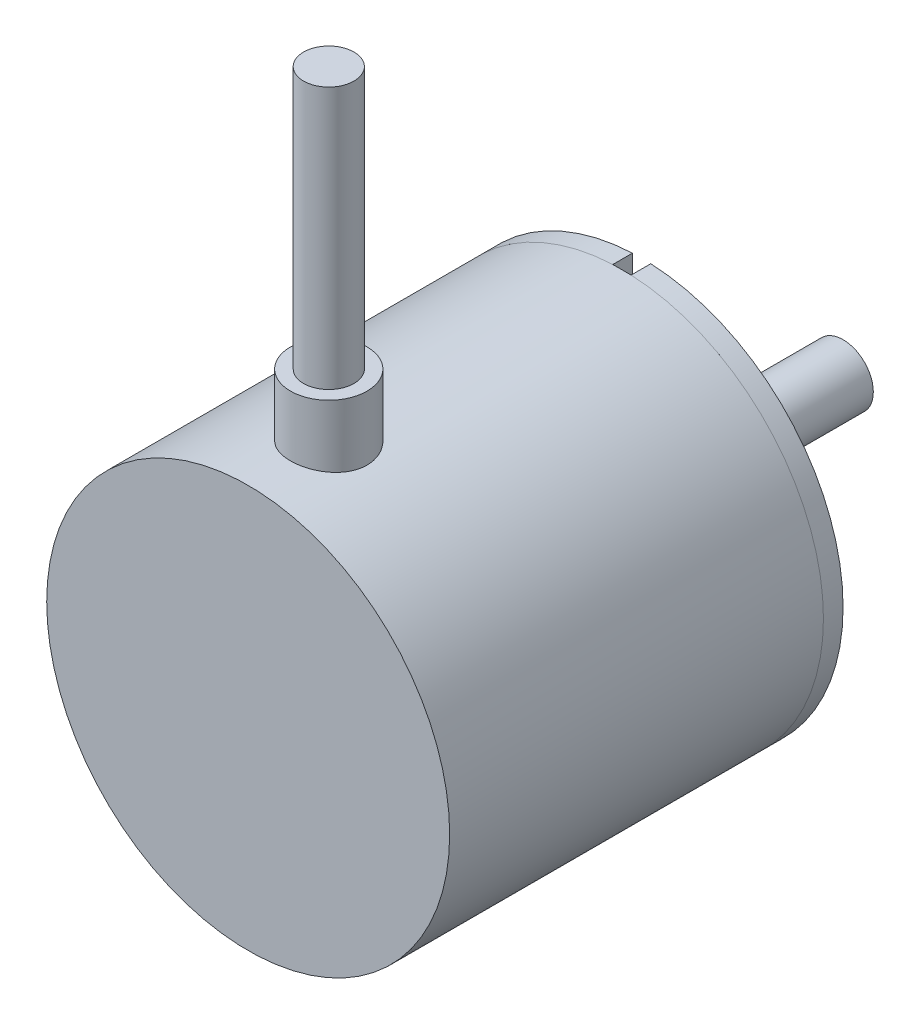
ISO-10303-21;
HEADER;
FILE_DESCRIPTION(('STEP AP214'),'2;1');
FILE_NAME('part.step','',(''),(''),'','','');
FILE_SCHEMA(('AUTOMOTIVE_DESIGN { 1 0 10303 214 1 1 1 1 }'));
ENDSEC;
DATA;
#1=APPLICATION_CONTEXT('core data for automotive mechanical design processes');
#2=APPLICATION_PROTOCOL_DEFINITION('international standard','automotive_design',2000,#1);
#3=PRODUCT_CONTEXT('',#1,'mechanical');
#4=PRODUCT('Part','Part','',(#3));
#5=PRODUCT_RELATED_PRODUCT_CATEGORY('part','',(#4));
#6=PRODUCT_DEFINITION_FORMATION('','',#4);
#7=PRODUCT_DEFINITION_CONTEXT('part definition',#1,'design');
#8=PRODUCT_DEFINITION('design','',#6,#7);
#9=PRODUCT_DEFINITION_SHAPE('','',#8);
#10=(LENGTH_UNIT() NAMED_UNIT(*) SI_UNIT(.MILLI.,.METRE.));
#11=(NAMED_UNIT(*) PLANE_ANGLE_UNIT() SI_UNIT($,.RADIAN.));
#12=(NAMED_UNIT(*) SI_UNIT($,.STERADIAN.) SOLID_ANGLE_UNIT());
#13=UNCERTAINTY_MEASURE_WITH_UNIT(LENGTH_MEASURE(1.E-05),#10,'distance_accuracy_value','');
#14=(GEOMETRIC_REPRESENTATION_CONTEXT(3) GLOBAL_UNCERTAINTY_ASSIGNED_CONTEXT((#13)) GLOBAL_UNIT_ASSIGNED_CONTEXT((#10,
#11,#12)) REPRESENTATION_CONTEXT('',''));
#15=CARTESIAN_POINT('',(0.,0.,0.));
#16=DIRECTION('',(0.,0.,1.));
#17=DIRECTION('',(1.,0.,0.));
#18=AXIS2_PLACEMENT_3D('',#15,#16,#17);
#19=CARTESIAN_POINT('',(0.,0.,0.));
#20=DIRECTION('',(0.,0.,1.));
#21=DIRECTION('',(1.,0.,0.));
#22=AXIS2_PLACEMENT_3D('',#19,#20,#21);
#23=PLANE('',#22);
#24=CARTESIAN_POINT('',(0.,0.,0.));
#25=DIRECTION('',(0.,0.,1.));
#26=DIRECTION('',(1.,0.,0.));
#27=AXIS2_PLACEMENT_3D('',#24,#25,#26);
#28=CIRCLE('',#27,10.);
#29=CARTESIAN_POINT('',(10.,0.,0.));
#30=VERTEX_POINT('',#29);
#31=EDGE_CURVE('E135',#30,#30,#28,.F.);
#32=ORIENTED_EDGE('',*,*,#31,.F.);
#33=EDGE_LOOP('',(#32));
#34=FACE_BOUND('',#33,.T.);
#35=CARTESIAN_POINT('',(0.,15.,0.));
#36=DIRECTION('',(0.,0.,-1.));
#37=DIRECTION('',(-1.,0.,0.));
#38=AXIS2_PLACEMENT_3D('',#35,#36,#37);
#39=CIRCLE('',#38,1.00000000000079);
#40=CARTESIAN_POINT('',(-1.00000000000079,15.,0.));
#41=VERTEX_POINT('',#40);
#42=EDGE_CURVE('E149',#41,#41,#39,.T.);
#43=ORIENTED_EDGE('',*,*,#42,.F.);
#44=EDGE_LOOP('',(#43));
#45=FACE_BOUND('',#44,.T.);
#46=CARTESIAN_POINT('',(-12.9903810567675,-7.49999999999947,0.));
#47=DIRECTION('',(0.,0.,-1.));
#48=DIRECTION('',(-1.,0.,0.));
#49=AXIS2_PLACEMENT_3D('',#46,#47,#48);
#50=CIRCLE('',#49,1.00000000000079);
#51=CARTESIAN_POINT('',(-13.9903810567683,-7.49999999999947,0.));
#52=VERTEX_POINT('',#51);
#53=EDGE_CURVE('E154',#52,#52,#50,.T.);
#54=ORIENTED_EDGE('',*,*,#53,.F.);
#55=EDGE_LOOP('',(#54));
#56=FACE_BOUND('',#55,.T.);
#57=CARTESIAN_POINT('',(12.9903810567657,-7.50000000000052,0.));
#58=DIRECTION('',(0.,0.,-1.));
#59=DIRECTION('',(-1.,0.,0.));
#60=AXIS2_PLACEMENT_3D('',#57,#58,#59);
#61=CIRCLE('',#60,1.00000000000079);
#62=CARTESIAN_POINT('',(11.9903810567649,-7.50000000000052,0.));
#63=VERTEX_POINT('',#62);
#64=EDGE_CURVE('E158',#63,#63,#61,.T.);
#65=ORIENTED_EDGE('',*,*,#64,.F.);
#66=EDGE_LOOP('',(#65));
#67=FACE_BOUND('',#66,.T.);
#68=DIRECTION('',(0.,-1.,0.));
#69=VECTOR('',#68,1.);
#70=CARTESIAN_POINT('',(-0.91,0.,0.));
#71=LINE('',#70,#69);
#72=CARTESIAN_POINT('',(-0.91,19.9792867740568,0.));
#73=VERTEX_POINT('',#72);
#74=CARTESIAN_POINT('',(-0.91,18.0794623505173,0.));
#75=VERTEX_POINT('',#74);
#76=EDGE_CURVE('E104',#73,#75,#71,.T.);
#77=ORIENTED_EDGE('',*,*,#76,.T.);
#78=DIRECTION('',(-1.,0.,0.));
#79=VECTOR('',#78,1.);
#80=CARTESIAN_POINT('',(0.,18.0794623505173,0.));
#81=LINE('',#80,#79);
#82=CARTESIAN_POINT('',(0.91,18.0794623505173,0.));
#83=VERTEX_POINT('',#82);
#84=EDGE_CURVE('E86',#83,#75,#81,.T.);
#85=ORIENTED_EDGE('',*,*,#84,.F.);
#86=DIRECTION('',(0.,-1.,0.));
#87=VECTOR('',#86,1.);
#88=CARTESIAN_POINT('',(0.91,0.,0.));
#89=LINE('',#88,#87);
#90=CARTESIAN_POINT('',(0.91,19.9792867740568,0.));
#91=VERTEX_POINT('',#90);
#92=EDGE_CURVE('E94',#91,#83,#89,.T.);
#93=ORIENTED_EDGE('',*,*,#92,.F.);
#94=CARTESIAN_POINT('',(0.,0.,0.));
#95=DIRECTION('',(0.,0.,1.));
#96=DIRECTION('',(1.,0.,0.));
#97=AXIS2_PLACEMENT_3D('',#94,#95,#96);
#98=CIRCLE('',#97,20.);
#99=EDGE_CURVE('E165',#73,#91,#98,.T.);
#100=ORIENTED_EDGE('',*,*,#99,.F.);
#101=EDGE_LOOP('',(#77,#85,#93,#100));
#102=FACE_BOUND('',#101,.T.);
#103=ADVANCED_FACE('F47',(#34,#45,#56,#67,#102),#23,.F.);
#104=CARTESIAN_POINT('',(0.,0.,1.95));
#105=DIRECTION('',(0.,0.,-1.));
#106=DIRECTION('',(-1.,0.,0.));
#107=AXIS2_PLACEMENT_3D('',#104,#105,#106);
#108=CYLINDRICAL_SURFACE('',#107,20.);
#109=DIRECTION('',(0.,0.,-1.));
#110=VECTOR('',#109,1.);
#111=CARTESIAN_POINT('',(-0.91,19.9792867740568,2.3));
#112=LINE('',#111,#110);
#113=CARTESIAN_POINT('',(-0.91,19.9792867740568,1.95));
#114=VERTEX_POINT('',#113);
#115=EDGE_CURVE('E116',#114,#73,#112,.T.);
#116=ORIENTED_EDGE('',*,*,#115,.T.);
#117=ORIENTED_EDGE('',*,*,#99,.T.);
#118=DIRECTION('',(0.,0.,-1.));
#119=VECTOR('',#118,1.);
#120=CARTESIAN_POINT('',(0.91,19.9792867740568,2.3));
#121=LINE('',#120,#119);
#122=CARTESIAN_POINT('',(0.91,19.9792867740568,1.95));
#123=VERTEX_POINT('',#122);
#124=EDGE_CURVE('E97',#123,#91,#121,.T.);
#125=ORIENTED_EDGE('',*,*,#124,.F.);
#126=CARTESIAN_POINT('',(0.,0.,1.95));
#127=DIRECTION('',(0.,0.,1.));
#128=DIRECTION('',(1.,0.,0.));
#129=AXIS2_PLACEMENT_3D('',#126,#127,#128);
#130=CIRCLE('',#129,20.);
#131=EDGE_CURVE('E136',#114,#123,#130,.T.);
#132=ORIENTED_EDGE('',*,*,#131,.F.);
#133=EDGE_LOOP('',(#116,#117,#125,#132));
#134=FACE_BOUND('',#133,.T.);
#135=ADVANCED_FACE('F187',(#134),#108,.T.);
#136=CARTESIAN_POINT('',(0.,0.,1.95));
#137=DIRECTION('',(0.,0.,1.));
#138=DIRECTION('',(1.,0.,0.));
#139=AXIS2_PLACEMENT_3D('',#136,#137,#138);
#140=PLANE('',#139);
#141=CARTESIAN_POINT('',(0.,15.,1.95));
#142=DIRECTION('',(0.,0.,1.));
#143=DIRECTION('',(1.,0.,0.));
#144=AXIS2_PLACEMENT_3D('',#141,#142,#143);
#145=CIRCLE('',#144,1.00000000000079);
#146=CARTESIAN_POINT('',(1.00000000000079,15.,1.95));
#147=VERTEX_POINT('',#146);
#148=EDGE_CURVE('E141',#147,#147,#145,.T.);
#149=ORIENTED_EDGE('',*,*,#148,.F.);
#150=EDGE_LOOP('',(#149));
#151=FACE_BOUND('',#150,.T.);
#152=CARTESIAN_POINT('',(-12.9903810567675,-7.49999999999947,1.95));
#153=DIRECTION('',(0.,0.,1.));
#154=DIRECTION('',(1.,0.,0.));
#155=AXIS2_PLACEMENT_3D('',#152,#153,#154);
#156=CIRCLE('',#155,1.00000000000079);
#157=CARTESIAN_POINT('',(-11.9903810567667,-7.49999999999947,1.95));
#158=VERTEX_POINT('',#157);
#159=EDGE_CURVE('E153',#158,#158,#156,.T.);
#160=ORIENTED_EDGE('',*,*,#159,.F.);
#161=EDGE_LOOP('',(#160));
#162=FACE_BOUND('',#161,.T.);
#163=CARTESIAN_POINT('',(12.9903810567657,-7.50000000000052,1.95));
#164=DIRECTION('',(0.,0.,1.));
#165=DIRECTION('',(1.,0.,0.));
#166=AXIS2_PLACEMENT_3D('',#163,#164,#165);
#167=CIRCLE('',#166,1.00000000000079);
#168=CARTESIAN_POINT('',(13.9903810567665,-7.50000000000052,1.95));
#169=VERTEX_POINT('',#168);
#170=EDGE_CURVE('E157',#169,#169,#167,.T.);
#171=ORIENTED_EDGE('',*,*,#170,.F.);
#172=EDGE_LOOP('',(#171));
#173=FACE_BOUND('',#172,.T.);
#174=DIRECTION('',(1.,0.,0.));
#175=VECTOR('',#174,1.);
#176=CARTESIAN_POINT('',(0.,18.0794623505173,1.95));
#177=LINE('',#176,#175);
#178=CARTESIAN_POINT('',(-0.91,18.0794623505173,1.95));
#179=VERTEX_POINT('',#178);
#180=CARTESIAN_POINT('',(0.91,18.0794623505173,1.95));
#181=VERTEX_POINT('',#180);
#182=EDGE_CURVE('E89',#179,#181,#177,.T.);
#183=ORIENTED_EDGE('',*,*,#182,.F.);
#184=DIRECTION('',(0.,1.,0.));
#185=VECTOR('',#184,1.);
#186=CARTESIAN_POINT('',(-0.91,0.,1.95));
#187=LINE('',#186,#185);
#188=EDGE_CURVE('E145',#179,#114,#187,.T.);
#189=ORIENTED_EDGE('',*,*,#188,.T.);
#190=ORIENTED_EDGE('',*,*,#131,.T.);
#191=DIRECTION('',(0.,1.,0.));
#192=VECTOR('',#191,1.);
#193=CARTESIAN_POINT('',(0.91,0.,1.95));
#194=LINE('',#193,#192);
#195=EDGE_CURVE('E106',#181,#123,#194,.T.);
#196=ORIENTED_EDGE('',*,*,#195,.F.);
#197=EDGE_LOOP('',(#183,#189,#190,#196));
#198=FACE_BOUND('',#197,.T.);
#199=ADVANCED_FACE('F128',(#151,#162,#173,#198),#140,.T.);
#200=CARTESIAN_POINT('',(0.,0.,-5.));
#201=DIRECTION('',(0.,0.,-1.));
#202=DIRECTION('',(-1.,0.,0.));
#203=AXIS2_PLACEMENT_3D('',#200,#201,#202);
#204=PLANE('',#203);
#205=CARTESIAN_POINT('',(0.,0.,-5.));
#206=DIRECTION('',(0.,0.,-1.));
#207=DIRECTION('',(-1.,0.,0.));
#208=AXIS2_PLACEMENT_3D('',#205,#206,#207);
#209=CIRCLE('',#208,7.5);
#210=CARTESIAN_POINT('',(-7.5,0.,-5.));
#211=VERTEX_POINT('',#210);
#212=EDGE_CURVE('E57',#211,#211,#209,.T.);
#213=ORIENTED_EDGE('',*,*,#212,.F.);
#214=EDGE_LOOP('',(#213));
#215=FACE_BOUND('',#214,.T.);
#216=CARTESIAN_POINT('',(0.,0.,-5.));
#217=DIRECTION('',(0.,0.,-1.));
#218=DIRECTION('',(-1.,0.,0.));
#219=AXIS2_PLACEMENT_3D('',#216,#217,#218);
#220=CIRCLE('',#219,10.);
#221=CARTESIAN_POINT('',(-10.,0.,-5.));
#222=VERTEX_POINT('',#221);
#223=EDGE_CURVE('E132',#222,#222,#220,.T.);
#224=ORIENTED_EDGE('',*,*,#223,.T.);
#225=EDGE_LOOP('',(#224));
#226=FACE_BOUND('',#225,.T.);
#227=ADVANCED_FACE('F124',(#215,#226),#204,.T.);
#228=CARTESIAN_POINT('',(0.,0.,-5.));
#229=DIRECTION('',(0.,0.,1.));
#230=DIRECTION('',(1.,0.,0.));
#231=AXIS2_PLACEMENT_3D('',#228,#229,#230);
#232=CYLINDRICAL_SURFACE('',#231,10.);
#233=ORIENTED_EDGE('',*,*,#223,.F.);
#234=EDGE_LOOP('',(#233));
#235=FACE_BOUND('',#234,.T.);
#236=ORIENTED_EDGE('',*,*,#31,.T.);
#237=EDGE_LOOP('',(#236));
#238=FACE_BOUND('',#237,.T.);
#239=ADVANCED_FACE('F127',(#235,#238),#232,.T.);
#240=CARTESIAN_POINT('',(0.,15.,10.));
#241=DIRECTION('',(0.,0.,-1.));
#242=DIRECTION('',(-1.,0.,0.));
#243=AXIS2_PLACEMENT_3D('',#240,#241,#242);
#244=CYLINDRICAL_SURFACE('',#243,1.00000000000079);
#245=ORIENTED_EDGE('',*,*,#148,.T.);
#246=EDGE_LOOP('',(#245));
#247=FACE_BOUND('',#246,.T.);
#248=ORIENTED_EDGE('',*,*,#42,.T.);
#249=EDGE_LOOP('',(#248));
#250=FACE_BOUND('',#249,.T.);
#251=ADVANCED_FACE('F200',(#247,#250),#244,.F.);
#252=CARTESIAN_POINT('',(-12.9903810567675,-7.49999999999947,10.));
#253=DIRECTION('',(0.,0.,-1.));
#254=DIRECTION('',(-1.,0.,0.));
#255=AXIS2_PLACEMENT_3D('',#252,#253,#254);
#256=CYLINDRICAL_SURFACE('',#255,1.00000000000079);
#257=ORIENTED_EDGE('',*,*,#159,.T.);
#258=EDGE_LOOP('',(#257));
#259=FACE_BOUND('',#258,.T.);
#260=ORIENTED_EDGE('',*,*,#53,.T.);
#261=EDGE_LOOP('',(#260));
#262=FACE_BOUND('',#261,.T.);
#263=ADVANCED_FACE('F204',(#259,#262),#256,.F.);
#264=CARTESIAN_POINT('',(12.9903810567657,-7.50000000000052,10.));
#265=DIRECTION('',(0.,0.,-1.));
#266=DIRECTION('',(-1.,0.,0.));
#267=AXIS2_PLACEMENT_3D('',#264,#265,#266);
#268=CYLINDRICAL_SURFACE('',#267,1.00000000000079);
#269=ORIENTED_EDGE('',*,*,#170,.T.);
#270=EDGE_LOOP('',(#269));
#271=FACE_BOUND('',#270,.T.);
#272=ORIENTED_EDGE('',*,*,#64,.T.);
#273=EDGE_LOOP('',(#272));
#274=FACE_BOUND('',#273,.T.);
#275=ADVANCED_FACE('F208',(#271,#274),#268,.F.);
#276=CARTESIAN_POINT('',(-0.91,0.,2.3));
#277=DIRECTION('',(1.,0.,0.));
#278=DIRECTION('',(0.,0.,-1.));
#279=AXIS2_PLACEMENT_3D('',#276,#277,#278);
#280=PLANE('',#279);
#281=DIRECTION('',(0.,0.,-1.));
#282=VECTOR('',#281,1.);
#283=CARTESIAN_POINT('',(-0.91,18.0794623505173,2.3));
#284=LINE('',#283,#282);
#285=EDGE_CURVE('E113',#179,#75,#284,.T.);
#286=ORIENTED_EDGE('',*,*,#285,.T.);
#287=ORIENTED_EDGE('',*,*,#76,.F.);
#288=ORIENTED_EDGE('',*,*,#115,.F.);
#289=ORIENTED_EDGE('',*,*,#188,.F.);
#290=EDGE_LOOP('',(#286,#287,#288,#289));
#291=FACE_BOUND('',#290,.T.);
#292=ADVANCED_FACE('F186',(#291),#280,.T.);
#293=CARTESIAN_POINT('',(0.,18.0794623505173,2.3));
#294=DIRECTION('',(0.,-1.,0.));
#295=DIRECTION('',(0.,0.,-1.));
#296=AXIS2_PLACEMENT_3D('',#293,#294,#295);
#297=PLANE('',#296);
#298=ORIENTED_EDGE('',*,*,#182,.T.);
#299=DIRECTION('',(0.,0.,-1.));
#300=VECTOR('',#299,1.);
#301=CARTESIAN_POINT('',(0.91,18.0794623505173,2.3));
#302=LINE('',#301,#300);
#303=EDGE_CURVE('E65',#181,#83,#302,.T.);
#304=ORIENTED_EDGE('',*,*,#303,.T.);
#305=ORIENTED_EDGE('',*,*,#84,.T.);
#306=ORIENTED_EDGE('',*,*,#285,.F.);
#307=EDGE_LOOP('',(#298,#304,#305,#306));
#308=FACE_BOUND('',#307,.T.);
#309=ADVANCED_FACE('F83',(#308),#297,.F.);
#310=CARTESIAN_POINT('',(0.91,0.,2.3));
#311=DIRECTION('',(1.,0.,0.));
#312=DIRECTION('',(0.,0.,-1.));
#313=AXIS2_PLACEMENT_3D('',#310,#311,#312);
#314=PLANE('',#313);
#315=ORIENTED_EDGE('',*,*,#195,.T.);
#316=ORIENTED_EDGE('',*,*,#124,.T.);
#317=ORIENTED_EDGE('',*,*,#92,.T.);
#318=ORIENTED_EDGE('',*,*,#303,.F.);
#319=EDGE_LOOP('',(#315,#316,#317,#318));
#320=FACE_BOUND('',#319,.T.);
#321=ADVANCED_FACE('F95',(#320),#314,.F.);
#322=CARTESIAN_POINT('',(0.,0.,-4.9));
#323=DIRECTION('',(0.,0.,-1.));
#324=DIRECTION('',(-1.,0.,0.));
#325=AXIS2_PLACEMENT_3D('',#322,#323,#324);
#326=CYLINDRICAL_SURFACE('',#325,7.5);
#327=CARTESIAN_POINT('',(0.,0.,-4.9));
#328=DIRECTION('',(0.,0.,-1.));
#329=DIRECTION('',(-1.,0.,0.));
#330=AXIS2_PLACEMENT_3D('',#327,#328,#329);
#331=CIRCLE('',#330,7.5);
#332=CARTESIAN_POINT('',(-7.5,0.,-4.9));
#333=VERTEX_POINT('',#332);
#334=EDGE_CURVE('E12',#333,#333,#331,.T.);
#335=ORIENTED_EDGE('',*,*,#334,.F.);
#336=EDGE_LOOP('',(#335));
#337=FACE_BOUND('',#336,.T.);
#338=ORIENTED_EDGE('',*,*,#212,.T.);
#339=EDGE_LOOP('',(#338));
#340=FACE_BOUND('',#339,.T.);
#341=ADVANCED_FACE('F122',(#337,#340),#326,.F.);
#342=CARTESIAN_POINT('',(0.,0.,-4.9));
#343=DIRECTION('',(0.,0.,-1.));
#344=DIRECTION('',(-1.,0.,0.));
#345=AXIS2_PLACEMENT_3D('',#342,#343,#344);
#346=PLANE('',#345);
#347=ORIENTED_EDGE('',*,*,#334,.T.);
#348=EDGE_LOOP('',(#347));
#349=FACE_BOUND('',#348,.T.);
#350=ADVANCED_FACE('F49',(#349),#346,.T.);
#351=CLOSED_SHELL('',(#103,#135,#199,#227,#239,#251,#263,#275,#292,#309,#321,#341,#350));
#352=MANIFOLD_SOLID_BREP('B2',#351);
#353=CARTESIAN_POINT('',(0.,26.,31.05));
#354=DIRECTION('',(0.,1.,0.));
#355=DIRECTION('',(0.,0.,1.));
#356=AXIS2_PLACEMENT_3D('',#353,#354,#355);
#357=PLANE('',#356);
#358=CARTESIAN_POINT('',(0.,26.,31.05));
#359=DIRECTION('',(0.,1.,0.));
#360=DIRECTION('',(0.,0.,1.));
#361=AXIS2_PLACEMENT_3D('',#358,#359,#360);
#362=CIRCLE('',#361,3.8);
#363=CARTESIAN_POINT('',(0.,26.,34.85));
#364=VERTEX_POINT('',#363);
#365=EDGE_CURVE('E379',#364,#364,#362,.T.);
#366=ORIENTED_EDGE('',*,*,#365,.T.);
#367=EDGE_LOOP('',(#366));
#368=FACE_BOUND('',#367,.T.);
#369=CARTESIAN_POINT('',(0.,26.,31.05));
#370=DIRECTION('',(0.,1.,0.));
#371=DIRECTION('',(0.,0.,1.));
#372=AXIS2_PLACEMENT_3D('',#369,#370,#371);
#373=CIRCLE('',#372,2.5);
#374=CARTESIAN_POINT('',(0.,26.,28.55));
#375=VERTEX_POINT('',#374);
#376=EDGE_CURVE('E385',#375,#375,#373,.T.);
#377=ORIENTED_EDGE('',*,*,#376,.F.);
#378=EDGE_LOOP('',(#377));
#379=FACE_BOUND('',#378,.T.);
#380=ADVANCED_FACE('F355',(#368,#379),#357,.T.);
#381=CARTESIAN_POINT('',(0.,0.,39.05));
#382=DIRECTION('',(0.,0.,-1.));
#383=DIRECTION('',(-1.,0.,0.));
#384=AXIS2_PLACEMENT_3D('',#381,#382,#383);
#385=CYLINDRICAL_SURFACE('',#384,20.);
#386=CARTESIAN_POINT('',(0.,0.,1.95));
#387=DIRECTION('',(0.,0.,1.));
#388=DIRECTION('',(1.,0.,0.));
#389=AXIS2_PLACEMENT_3D('',#386,#387,#388);
#390=CIRCLE('',#389,20.);
#391=CARTESIAN_POINT('',(20.,0.,1.95));
#392=VERTEX_POINT('',#391);
#393=EDGE_CURVE('E373',#392,#392,#390,.T.);
#394=ORIENTED_EDGE('',*,*,#393,.T.);
#395=EDGE_LOOP('',(#394));
#396=FACE_BOUND('',#395,.T.);
#397=CARTESIAN_POINT('',(0.,0.,39.05));
#398=DIRECTION('',(0.,0.,1.));
#399=DIRECTION('',(1.,0.,0.));
#400=AXIS2_PLACEMENT_3D('',#397,#398,#399);
#401=CIRCLE('',#400,20.);
#402=CARTESIAN_POINT('',(20.,0.,39.05));
#403=VERTEX_POINT('',#402);
#404=EDGE_CURVE('E367',#403,#403,#401,.T.);
#405=ORIENTED_EDGE('',*,*,#404,.F.);
#406=EDGE_LOOP('',(#405));
#407=FACE_BOUND('',#406,.T.);
#408=CARTESIAN_POINT('',(0.,20.,27.25));
#409=CARTESIAN_POINT('',(-0.211409170467327,19.9999961542323,27.2500080221101));
#410=CARTESIAN_POINT('',(-0.422922127898354,19.9966133928819,27.2677019195789));
#411=CARTESIAN_POINT('',(-0.839984159024682,19.9834449848688,27.3379623654532));
#412=CARTESIAN_POINT('',(-1.04552810753821,19.9736539963158,27.390558008419));
#413=CARTESIAN_POINT('',(-1.44456049920717,19.9487640007985,27.528950449601));
#414=CARTESIAN_POINT('',(-1.63805977200262,19.9336698456168,27.6147169075731));
#415=CARTESIAN_POINT('',(-2.00790510956374,19.8998203363427,27.8169294664745));
#416=CARTESIAN_POINT('',(-2.18425248934359,19.8810652632604,27.9333732128719));
#417=CARTESIAN_POINT('',(-2.51697105215255,19.8417053033425,28.195152721675));
#418=CARTESIAN_POINT('',(-2.67310113064527,19.8210823362121,28.3407922378417));
#419=CARTESIAN_POINT('',(-2.95886696734129,19.7804445961867,28.6561757865699));
#420=CARTESIAN_POINT('',(-3.08850079078569,19.7604298677961,28.8259215778409));
#421=CARTESIAN_POINT('',(-3.31860168020194,19.7230988451207,29.1864090605948));
#422=CARTESIAN_POINT('',(-3.41882262654874,19.705805853158,29.37731047713));
#423=CARTESIAN_POINT('',(-3.58567706988605,19.6761314285786,29.7736245855497));
#424=CARTESIAN_POINT('',(-3.6523135449711,19.6637495604899,29.9790359889224));
#425=CARTESIAN_POINT('',(-3.74933194374608,19.6454814650498,30.3959565887778));
#426=CARTESIAN_POINT('',(-3.78013484392349,19.6395198747464,30.607364455082));
#427=CARTESIAN_POINT('',(-3.80591857594181,19.634540186021,31.0324252533447));
#428=CARTESIAN_POINT('',(-3.80090270756635,19.6355214479927,31.2460779766861));
#429=CARTESIAN_POINT('',(-3.75553244831974,19.6442480072405,31.6665079036574));
#430=CARTESIAN_POINT('',(-3.71565751410713,19.6519015293418,31.8733390341715));
#431=CARTESIAN_POINT('',(-3.60245643623646,19.6729660265244,32.277321398546));
#432=CARTESIAN_POINT('',(-3.52912883658626,19.6863772522022,32.4744722106669));
#433=CARTESIAN_POINT('',(-3.35063720584687,19.7175415756265,32.8548962890743));
#434=CARTESIAN_POINT('',(-3.24528027247544,19.7353208526614,33.038076814078));
#435=CARTESIAN_POINT('',(-3.00585703473046,19.7732007899193,33.3843394509841));
#436=CARTESIAN_POINT('',(-2.87178774114429,19.7933016917437,33.5474194674571));
#437=CARTESIAN_POINT('',(-2.57616400040746,19.8339594539179,33.8516213185564));
#438=CARTESIAN_POINT('',(-2.41419962980204,19.8545184267878,33.9923448095286));
#439=CARTESIAN_POINT('',(-2.06875314340881,19.8934769245016,34.244684963348));
#440=CARTESIAN_POINT('',(-1.88527080077558,19.9118764265761,34.3563013193038));
#441=CARTESIAN_POINT('',(-1.50157598041669,19.9444815207307,34.5473204324655));
#442=CARTESIAN_POINT('',(-1.30134198123535,19.9586816081353,34.6266809586306));
#443=CARTESIAN_POINT('',(-0.890054959011917,19.9812455258448,34.7505286338464));
#444=CARTESIAN_POINT('',(-0.679003119317512,19.9896099930434,34.7950195885914));
#445=CARTESIAN_POINT('',(-0.255497719579876,19.9994725007416,34.8473088773612));
#446=CARTESIAN_POINT('',(-0.0431138328322673,20.0010726444528,34.855652875173));
#447=CARTESIAN_POINT('',(0.380014191672976,19.9975085572427,34.836876225767));
#448=CARTESIAN_POINT('',(0.590758411707601,19.9923446679653,34.8097573697398));
#449=CARTESIAN_POINT('',(1.00288830549625,19.975896378801,34.7212784196605));
#450=CARTESIAN_POINT('',(1.20433556626006,19.9646614874827,34.6601951873359));
#451=CARTESIAN_POINT('',(1.59412952640163,19.9373258457065,34.5058215920311));
#452=CARTESIAN_POINT('',(1.78247531674335,19.9212247580245,34.4125289969003));
#453=CARTESIAN_POINT('',(2.14304328890291,19.8856880666302,34.195182519842));
#454=CARTESIAN_POINT('',(2.31506151518706,19.8662171733405,34.0707961735566));
#455=CARTESIAN_POINT('',(2.63597913374777,19.8261901171718,33.7952420238678));
#456=CARTESIAN_POINT('',(2.78487630264077,19.8056338501746,33.6440716478284));
#457=CARTESIAN_POINT('',(3.05740496097472,19.765413070904,33.3167675589537));
#458=CARTESIAN_POINT('',(3.18066362671236,19.7457645712979,33.1403211179015));
#459=CARTESIAN_POINT('',(3.39579291791139,19.7099095371909,32.7689070607635));
#460=CARTESIAN_POINT('',(3.48766472876849,19.6937028727101,32.5739401445009));
#461=CARTESIAN_POINT('',(3.63688763834375,19.6666928737216,32.1719537976212));
#462=CARTESIAN_POINT('',(3.69440774330493,19.65586313059,31.9649989621616));
#463=CARTESIAN_POINT('',(3.77381405210164,19.6407736637121,31.5441366655658));
#464=CARTESIAN_POINT('',(3.79570439701343,19.6365131764557,31.3302300153537));
#465=CARTESIAN_POINT('',(3.80308834618145,19.6350840546938,30.9052722601002));
#466=CARTESIAN_POINT('',(3.78917023724654,19.6378007920638,30.694231539121));
#467=CARTESIAN_POINT('',(3.72662235451709,19.6497654576093,30.2775567264854));
#468=CARTESIAN_POINT('',(3.67799280145929,19.6590133442521,30.071922600456));
#469=CARTESIAN_POINT('',(3.5476534675359,19.682949445638,29.6722259316191));
#470=CARTESIAN_POINT('',(3.46600904087706,19.6976269074675,29.4781413916689));
#471=CARTESIAN_POINT('',(3.27202248901276,19.7307756869829,29.1063314638588));
#472=CARTESIAN_POINT('',(3.159678114922,19.7492472825785,28.9286072757309));
#473=CARTESIAN_POINT('',(2.90544249950504,19.7882578785796,28.5916195556383));
#474=CARTESIAN_POINT('',(2.76312375644477,19.8088242859378,28.4326816630379));
#475=CARTESIAN_POINT('',(2.45386904920005,19.849503793334,28.1407474229982));
#476=CARTESIAN_POINT('',(2.28692743807455,19.8696167881647,28.0077570425845));
#477=CARTESIAN_POINT('',(1.93130804184856,19.907342517305,27.7703371149878));
#478=CARTESIAN_POINT('',(1.74244286895555,19.9249303089506,27.6661841532342));
#479=CARTESIAN_POINT('',(1.34961886753758,19.955380052388,27.4912547671515));
#480=CARTESIAN_POINT('',(1.1456743110793,19.9682464057595,27.4204472388684));
#481=CARTESIAN_POINT('',(0.784297688068416,19.9852044773219,27.328466621649));
#482=CARTESIAN_POINT('',(0.628967830047845,19.9907212439867,27.2990923477028));
#483=CARTESIAN_POINT('',(0.315777906585669,19.9981203933227,27.2598563003173));
#484=CARTESIAN_POINT('',(0.157917908583858,20.0000028727022,27.2499940076637));
#485=CARTESIAN_POINT('',(0.,20.,27.25));
#486=B_SPLINE_CURVE_WITH_KNOTS('',3,(#408,#409,#410,#411,#412,#413,#414,#415,#416,#417,#418,
#419,#420,#421,#422,#423,#424,#425,#426,#427,#428,#429,#430,#431,#432,#433,#434,#435,#436,#437,
#438,#439,#440,#441,#442,#443,#444,#445,#446,#447,#448,#449,#450,#451,#452,#453,#454,#455,#456,
#457,#458,#459,#460,#461,#462,#463,#464,#465,#466,#467,#468,#469,#470,#471,#472,#473,#474,#475,
#476,#477,#478,#479,#480,#481,#482,#483,#484,#485),.UNSPECIFIED.,.T.,.F.,(4,2,2,2,2,2,2,2,2,2,2,
2,2,2,2,2,2,2,2,2,2,2,2,2,2,2,2,2,2,2,2,2,2,2,2,2,2,2,4),(0.,0.633649957641686,1.26782879901445,
1.901428944657,2.53498047461306,3.17550182400964,3.81606992763611,4.4618545644225,
5.10758192633874,5.74564406057233,6.38364741445397,7.01301124078936,7.64240246213848,
8.27566203182482,8.90898756155413,9.55256883556786,10.1961568949143,10.8405848804157,
11.4849425227049,12.1195384701565,12.7541023660826,13.3835678603608,14.0130769861719,
14.6496287228807,15.2862416342732,15.931548745728,16.5768314830023,17.2189127787949,
17.8609194432256,18.4924463579162,19.1239692566416,19.7542481040081,20.3845731340266,
21.0245839956356,21.6647418644649,22.3108422133651,22.9563386931751,23.4296735948471,
23.9029959008938),.UNSPECIFIED.);
#487=CARTESIAN_POINT('',(0.,20.,27.25));
#488=VERTEX_POINT('',#487);
#489=EDGE_CURVE('E46',#488,#488,#486,.T.);
#490=ORIENTED_EDGE('',*,*,#489,.F.);
#491=EDGE_LOOP('',(#490));
#492=FACE_BOUND('',#491,.T.);
#493=ADVANCED_FACE('F357',(#396,#407,#492),#385,.T.);
#494=CARTESIAN_POINT('',(0.,0.,39.05));
#495=DIRECTION('',(0.,0.,1.));
#496=DIRECTION('',(1.,0.,0.));
#497=AXIS2_PLACEMENT_3D('',#494,#495,#496);
#498=PLANE('',#497);
#499=ORIENTED_EDGE('',*,*,#404,.T.);
#500=EDGE_LOOP('',(#499));
#501=FACE_BOUND('',#500,.T.);
#502=ADVANCED_FACE('F407',(#501),#498,.T.);
#503=CARTESIAN_POINT('',(0.,0.,1.95));
#504=DIRECTION('',(0.,0.,1.));
#505=DIRECTION('',(1.,0.,0.));
#506=AXIS2_PLACEMENT_3D('',#503,#504,#505);
#507=PLANE('',#506);
#508=ORIENTED_EDGE('',*,*,#393,.F.);
#509=EDGE_LOOP('',(#508));
#510=FACE_BOUND('',#509,.T.);
#511=ADVANCED_FACE('F413',(#510),#507,.F.);
#512=CARTESIAN_POINT('',(0.,26.,31.05));
#513=DIRECTION('',(0.,-1.,0.));
#514=DIRECTION('',(0.,0.,-1.));
#515=AXIS2_PLACEMENT_3D('',#512,#513,#514);
#516=CYLINDRICAL_SURFACE('',#515,3.8);
#517=ORIENTED_EDGE('',*,*,#365,.F.);
#518=EDGE_LOOP('',(#517));
#519=FACE_BOUND('',#518,.T.);
#520=ORIENTED_EDGE('',*,*,#489,.T.);
#521=EDGE_LOOP('',(#520));
#522=FACE_BOUND('',#521,.T.);
#523=ADVANCED_FACE('F397',(#519,#522),#516,.T.);
#524=CARTESIAN_POINT('',(0.,52.,31.05));
#525=DIRECTION('',(0.,-1.,0.));
#526=DIRECTION('',(0.,0.,-1.));
#527=AXIS2_PLACEMENT_3D('',#524,#525,#526);
#528=CYLINDRICAL_SURFACE('',#527,2.5);
#529=CARTESIAN_POINT('',(0.,52.,31.05));
#530=DIRECTION('',(0.,1.,0.));
#531=DIRECTION('',(0.,0.,1.));
#532=AXIS2_PLACEMENT_3D('',#529,#530,#531);
#533=CIRCLE('',#532,2.5);
#534=CARTESIAN_POINT('',(0.,52.,28.55));
#535=VERTEX_POINT('',#534);
#536=EDGE_CURVE('E384',#535,#535,#533,.T.);
#537=CARTESIAN_POINT('',(0.,52.,28.55));
#538=CARTESIAN_POINT('',(0.,51.7291666666667,28.55));
#539=CARTESIAN_POINT('',(0.,51.4583333333333,28.55));
#540=CARTESIAN_POINT('',(0.,50.9166666666667,28.55));
#541=CARTESIAN_POINT('',(0.,50.6458333333333,28.55));
#542=CARTESIAN_POINT('',(0.,50.1041666666667,28.55));
#543=CARTESIAN_POINT('',(0.,49.8333333333333,28.55));
#544=CARTESIAN_POINT('',(0.,49.2916666666667,28.55));
#545=CARTESIAN_POINT('',(0.,49.0208333333333,28.55));
#546=CARTESIAN_POINT('',(0.,48.4791666666667,28.55));
#547=CARTESIAN_POINT('',(0.,48.2083333333333,28.55));
#548=CARTESIAN_POINT('',(0.,47.6666666666667,28.55));
#549=CARTESIAN_POINT('',(0.,47.3958333333333,28.55));
#550=CARTESIAN_POINT('',(0.,46.8541666666667,28.55));
#551=CARTESIAN_POINT('',(0.,46.5833333333333,28.55));
#552=CARTESIAN_POINT('',(0.,46.0416666666667,28.55));
#553=CARTESIAN_POINT('',(0.,45.7708333333333,28.55));
#554=CARTESIAN_POINT('',(0.,45.2291666666667,28.55));
#555=CARTESIAN_POINT('',(0.,44.9583333333333,28.55));
#556=CARTESIAN_POINT('',(0.,44.4166666666667,28.55));
#557=CARTESIAN_POINT('',(0.,44.1458333333333,28.55));
#558=CARTESIAN_POINT('',(0.,43.6041666666667,28.55));
#559=CARTESIAN_POINT('',(0.,43.3333333333333,28.55));
#560=CARTESIAN_POINT('',(0.,42.7916666666667,28.55));
#561=CARTESIAN_POINT('',(0.,42.5208333333333,28.55));
#562=CARTESIAN_POINT('',(0.,41.9791666666667,28.55));
#563=CARTESIAN_POINT('',(0.,41.7083333333333,28.55));
#564=CARTESIAN_POINT('',(0.,41.1666666666667,28.55));
#565=CARTESIAN_POINT('',(0.,40.8958333333333,28.55));
#566=CARTESIAN_POINT('',(0.,40.3541666666667,28.55));
#567=CARTESIAN_POINT('',(0.,40.0833333333333,28.55));
#568=CARTESIAN_POINT('',(0.,39.5416666666667,28.55));
#569=CARTESIAN_POINT('',(0.,39.2708333333333,28.55));
#570=CARTESIAN_POINT('',(0.,38.7291666666667,28.55));
#571=CARTESIAN_POINT('',(0.,38.4583333333333,28.55));
#572=CARTESIAN_POINT('',(0.,37.9166666666667,28.55));
#573=CARTESIAN_POINT('',(0.,37.6458333333333,28.55));
#574=CARTESIAN_POINT('',(0.,37.1041666666667,28.55));
#575=CARTESIAN_POINT('',(0.,36.8333333333333,28.55));
#576=CARTESIAN_POINT('',(0.,36.2916666666667,28.55));
#577=CARTESIAN_POINT('',(0.,36.0208333333333,28.55));
#578=CARTESIAN_POINT('',(0.,35.4791666666667,28.55));
#579=CARTESIAN_POINT('',(0.,35.2083333333333,28.55));
#580=CARTESIAN_POINT('',(0.,34.6666666666667,28.55));
#581=CARTESIAN_POINT('',(0.,34.3958333333333,28.55));
#582=CARTESIAN_POINT('',(0.,33.8541666666667,28.55));
#583=CARTESIAN_POINT('',(0.,33.5833333333333,28.55));
#584=CARTESIAN_POINT('',(0.,33.0416666666667,28.55));
#585=CARTESIAN_POINT('',(0.,32.7708333333333,28.55));
#586=CARTESIAN_POINT('',(0.,32.2291666666667,28.55));
#587=CARTESIAN_POINT('',(0.,31.9583333333333,28.55));
#588=CARTESIAN_POINT('',(0.,31.4166666666667,28.55));
#589=CARTESIAN_POINT('',(0.,31.1458333333333,28.55));
#590=CARTESIAN_POINT('',(0.,30.6041666666667,28.55));
#591=CARTESIAN_POINT('',(0.,30.3333333333333,28.55));
#592=CARTESIAN_POINT('',(0.,29.7916666666667,28.55));
#593=CARTESIAN_POINT('',(0.,29.5208333333333,28.55));
#594=CARTESIAN_POINT('',(0.,28.9791666666667,28.55));
#595=CARTESIAN_POINT('',(0.,28.7083333333333,28.55));
#596=CARTESIAN_POINT('',(0.,28.1666666666667,28.55));
#597=CARTESIAN_POINT('',(0.,27.8958333333333,28.55));
#598=CARTESIAN_POINT('',(0.,27.3541666666667,28.55));
#599=CARTESIAN_POINT('',(0.,27.0833333333333,28.55));
#600=CARTESIAN_POINT('',(0.,26.5416666666667,28.55));
#601=CARTESIAN_POINT('',(0.,26.2708333333333,28.55));
#602=CARTESIAN_POINT('',(0.,26.,28.55));
#603=B_SPLINE_CURVE_WITH_KNOTS('',3,(#537,#538,#539,#540,#541,#542,#543,#544,#545,#546,#547,
#548,#549,#550,#551,#552,#553,#554,#555,#556,#557,#558,#559,#560,#561,#562,#563,#564,#565,#566,
#567,#568,#569,#570,#571,#572,#573,#574,#575,#576,#577,#578,#579,#580,#581,#582,#583,#584,#585,
#586,#587,#588,#589,#590,#591,#592,#593,#594,#595,#596,#597,#598,#599,#600,#601,#602),
.UNSPECIFIED.,.F.,.F.,(4,2,2,2,2,2,2,2,2,2,2,2,2,2,2,2,2,2,2,2,2,2,2,2,2,2,2,2,2,2,2,2,4),(0.,
0.812499999999994,1.62499999999999,2.4375,3.25,4.0625,4.875,5.6875,6.49999999999999,
7.31249999999999,8.12499999999999,8.93749999999999,9.74999999999999,10.5625,11.375,12.1875,13.,
13.8125,14.625,15.4375,16.25,17.0625,17.875,18.6875,19.5,20.3125,21.125,21.9375,22.75,23.5625,
24.375,25.1875,26.),.UNSPECIFIED.);
#604=EDGE_CURVE('BSEAM394',#535,#375,#603,.T.);
#605=ORIENTED_EDGE('',*,*,#536,.F.);
#606=ORIENTED_EDGE('',*,*,#376,.T.);
#607=ORIENTED_EDGE('',*,*,#604,.T.);
#608=ORIENTED_EDGE('',*,*,#604,.F.);
#609=EDGE_LOOP('',(#605,#607,#606,#608));
#610=FACE_BOUND('',#609,.T.);
#611=ADVANCED_FACE('F394',(#610),#528,.T.);
#612=CARTESIAN_POINT('',(0.,52.,31.05));
#613=DIRECTION('',(0.,1.,0.));
#614=DIRECTION('',(0.,0.,1.));
#615=AXIS2_PLACEMENT_3D('',#612,#613,#614);
#616=PLANE('',#615);
#617=ORIENTED_EDGE('',*,*,#536,.T.);
#618=EDGE_LOOP('',(#617));
#619=FACE_BOUND('',#618,.T.);
#620=ADVANCED_FACE('F392',(#619),#616,.T.);
#621=CLOSED_SHELL('',(#380,#493,#502,#511,#523,#611,#620));
#622=MANIFOLD_SOLID_BREP('B6',#621);
#623=CARTESIAN_POINT('',(0.,0.,-20.));
#624=DIRECTION('',(0.,0.,-1.));
#625=DIRECTION('',(-1.,0.,0.));
#626=AXIS2_PLACEMENT_3D('',#623,#624,#625);
#627=PLANE('',#626);
#628=DIRECTION('',(1.,0.,0.));
#629=VECTOR('',#628,1.);
#630=CARTESIAN_POINT('',(2.92743788288171,-2.,-20.));
#631=LINE('',#630,#629);
#632=CARTESIAN_POINT('',(-2.23606797749979,-2.,-20.));
#633=VERTEX_POINT('',#632);
#634=CARTESIAN_POINT('',(2.23606797749979,-2.,-20.));
#635=VERTEX_POINT('',#634);
#636=EDGE_CURVE('E499',#633,#635,#631,.T.);
#637=ORIENTED_EDGE('',*,*,#636,.F.);
#638=CARTESIAN_POINT('',(0.,0.,-20.));
#639=DIRECTION('',(0.,0.,-1.));
#640=DIRECTION('',(-1.,0.,0.));
#641=AXIS2_PLACEMENT_3D('',#638,#639,#640);
#642=CIRCLE('',#641,3.);
#643=EDGE_CURVE('E505',#633,#635,#642,.T.);
#644=ORIENTED_EDGE('',*,*,#643,.T.);
#645=EDGE_LOOP('',(#637,#644));
#646=FACE_BOUND('',#645,.T.);
#647=ADVANCED_FACE('F472',(#646),#627,.T.);
#648=CARTESIAN_POINT('',(0.,0.,-20.));
#649=DIRECTION('',(0.,0.,1.));
#650=DIRECTION('',(1.,0.,0.));
#651=AXIS2_PLACEMENT_3D('',#648,#649,#650);
#652=CYLINDRICAL_SURFACE('',#651,3.);
#653=ORIENTED_EDGE('',*,*,#643,.F.);
#654=DIRECTION('',(0.,0.,1.));
#655=VECTOR('',#654,1.);
#656=CARTESIAN_POINT('',(-2.23606797749979,-2.,-20.));
#657=LINE('',#656,#655);
#658=CARTESIAN_POINT('',(-2.23606797749979,-2.,-11.));
#659=VERTEX_POINT('',#658);
#660=EDGE_CURVE('E353',#633,#659,#657,.T.);
#661=ORIENTED_EDGE('',*,*,#660,.T.);
#662=CARTESIAN_POINT('',(0.,0.,-11.));
#663=DIRECTION('',(0.,0.,1.));
#664=DIRECTION('',(1.,0.,0.));
#665=AXIS2_PLACEMENT_3D('',#662,#663,#664);
#666=CIRCLE('',#665,3.);
#667=CARTESIAN_POINT('',(2.23606797749979,-2.,-11.));
#668=VERTEX_POINT('',#667);
#669=EDGE_CURVE('E490',#659,#668,#666,.T.);
#670=ORIENTED_EDGE('',*,*,#669,.T.);
#671=DIRECTION('',(0.,0.,1.));
#672=VECTOR('',#671,1.);
#673=CARTESIAN_POINT('',(2.23606797749979,-2.,-20.));
#674=LINE('',#673,#672);
#675=EDGE_CURVE('E480',#668,#635,#674,.F.);
#676=ORIENTED_EDGE('',*,*,#675,.T.);
#677=EDGE_LOOP('',(#653,#661,#670,#676));
#678=FACE_BOUND('',#677,.T.);
#679=CARTESIAN_POINT('',(0.,0.,-5.));
#680=DIRECTION('',(0.,0.,-1.));
#681=DIRECTION('',(-1.,0.,0.));
#682=AXIS2_PLACEMENT_3D('',#679,#680,#681);
#683=CIRCLE('',#682,3.);
#684=CARTESIAN_POINT('',(-3.,0.,-5.));
#685=VERTEX_POINT('',#684);
#686=EDGE_CURVE('E509',#685,#685,#683,.T.);
#687=ORIENTED_EDGE('',*,*,#686,.T.);
#688=EDGE_LOOP('',(#687));
#689=FACE_BOUND('',#688,.T.);
#690=ADVANCED_FACE('F474',(#678,#689),#652,.T.);
#691=CARTESIAN_POINT('',(0.,0.,-5.));
#692=DIRECTION('',(0.,0.,-1.));
#693=DIRECTION('',(-1.,0.,0.));
#694=AXIS2_PLACEMENT_3D('',#691,#692,#693);
#695=PLANE('',#694);
#696=ORIENTED_EDGE('',*,*,#686,.F.);
#697=EDGE_LOOP('',(#696));
#698=FACE_BOUND('',#697,.T.);
#699=ADVANCED_FACE('F518',(#698),#695,.F.);
#700=CARTESIAN_POINT('',(2.92743788288171,-2.,-11.));
#701=DIRECTION('',(0.,1.,0.));
#702=DIRECTION('',(0.,0.,1.));
#703=AXIS2_PLACEMENT_3D('',#700,#701,#702);
#704=PLANE('',#703);
#705=ORIENTED_EDGE('',*,*,#636,.T.);
#706=ORIENTED_EDGE('',*,*,#675,.F.);
#707=DIRECTION('',(1.,0.,0.));
#708=VECTOR('',#707,1.);
#709=CARTESIAN_POINT('',(2.92743788288171,-2.,-11.));
#710=LINE('',#709,#708);
#711=EDGE_CURVE('E486',#659,#668,#710,.T.);
#712=ORIENTED_EDGE('',*,*,#711,.F.);
#713=ORIENTED_EDGE('',*,*,#660,.F.);
#714=EDGE_LOOP('',(#705,#706,#712,#713));
#715=FACE_BOUND('',#714,.T.);
#716=ADVANCED_FACE('F498',(#715),#704,.F.);
#717=CARTESIAN_POINT('',(0.,0.,-11.));
#718=DIRECTION('',(0.,0.,1.));
#719=DIRECTION('',(1.,0.,0.));
#720=AXIS2_PLACEMENT_3D('',#717,#718,#719);
#721=PLANE('',#720);
#722=ORIENTED_EDGE('',*,*,#711,.T.);
#723=ORIENTED_EDGE('',*,*,#669,.F.);
#724=EDGE_LOOP('',(#722,#723));
#725=FACE_BOUND('',#724,.T.);
#726=ADVANCED_FACE('F525',(#725),#721,.F.);
#727=CLOSED_SHELL('',(#647,#690,#699,#716,#726));
#728=MANIFOLD_SOLID_BREP('B41',#727);
#729=ADVANCED_BREP_SHAPE_REPRESENTATION('',(#18,#352,#622,#728),#14);
#730=SHAPE_DEFINITION_REPRESENTATION(#9,#729);
ENDSEC;
END-ISO-10303-21;
